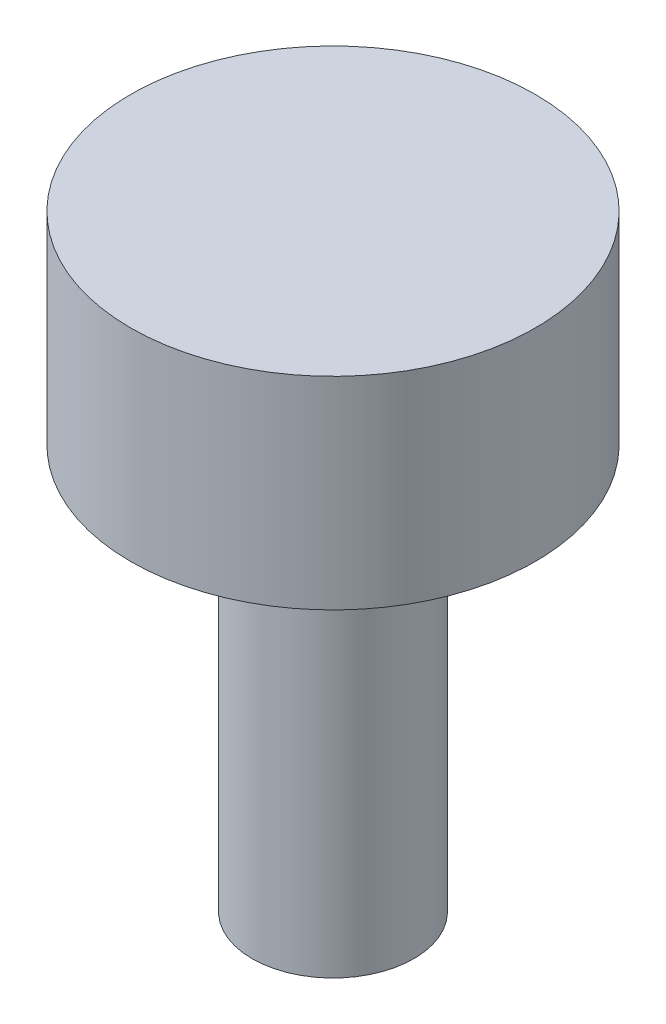
ISO-10303-21;
HEADER;
FILE_DESCRIPTION(('STEP AP214'),'2;1');
FILE_NAME('part.step','',(''),(''),'','','');
FILE_SCHEMA(('AUTOMOTIVE_DESIGN { 1 0 10303 214 1 1 1 1 }'));
ENDSEC;
DATA;
#1=APPLICATION_CONTEXT('core data for automotive mechanical design processes');
#2=APPLICATION_PROTOCOL_DEFINITION('international standard','automotive_design',2000,#1);
#3=PRODUCT_CONTEXT('',#1,'mechanical');
#4=PRODUCT('Part','Part','',(#3));
#5=PRODUCT_RELATED_PRODUCT_CATEGORY('part','',(#4));
#6=PRODUCT_DEFINITION_FORMATION('','',#4);
#7=PRODUCT_DEFINITION_CONTEXT('part definition',#1,'design');
#8=PRODUCT_DEFINITION('design','',#6,#7);
#9=PRODUCT_DEFINITION_SHAPE('','',#8);
#10=(LENGTH_UNIT() NAMED_UNIT(*) SI_UNIT(.MILLI.,.METRE.));
#11=(NAMED_UNIT(*) PLANE_ANGLE_UNIT() SI_UNIT($,.RADIAN.));
#12=(NAMED_UNIT(*) SI_UNIT($,.STERADIAN.) SOLID_ANGLE_UNIT());
#13=UNCERTAINTY_MEASURE_WITH_UNIT(LENGTH_MEASURE(1.E-05),#10,'distance_accuracy_value','');
#14=(GEOMETRIC_REPRESENTATION_CONTEXT(3) GLOBAL_UNCERTAINTY_ASSIGNED_CONTEXT((#13)) GLOBAL_UNIT_ASSIGNED_CONTEXT((#10,
#11,#12)) REPRESENTATION_CONTEXT('',''));
#15=CARTESIAN_POINT('',(0.,0.,0.));
#16=DIRECTION('',(0.,0.,1.));
#17=DIRECTION('',(1.,0.,0.));
#18=AXIS2_PLACEMENT_3D('',#15,#16,#17);
#19=CARTESIAN_POINT('',(0.,5.,0.));
#20=DIRECTION('',(0.,-1.,0.));
#21=DIRECTION('',(0.,0.,-1.));
#22=AXIS2_PLACEMENT_3D('',#19,#20,#21);
#23=CYLINDRICAL_SURFACE('',#22,1.);
#24=CARTESIAN_POINT('',(0.,5.,0.));
#25=DIRECTION('',(0.,1.,0.));
#26=DIRECTION('',(0.,0.,1.));
#27=AXIS2_PLACEMENT_3D('',#24,#25,#26);
#28=CIRCLE('',#27,1.);
#29=CARTESIAN_POINT('',(0.,5.,1.));
#30=VERTEX_POINT('',#29);
#31=EDGE_CURVE('E10',#30,#30,#28,.T.);
#32=ORIENTED_EDGE('',*,*,#31,.F.);
#33=EDGE_LOOP('',(#32));
#34=FACE_BOUND('',#33,.T.);
#35=CARTESIAN_POINT('',(0.,0.,0.));
#36=DIRECTION('',(0.,1.,0.));
#37=DIRECTION('',(0.,0.,1.));
#38=AXIS2_PLACEMENT_3D('',#35,#36,#37);
#39=CIRCLE('',#38,1.);
#40=CARTESIAN_POINT('',(0.,0.,1.));
#41=VERTEX_POINT('',#40);
#42=EDGE_CURVE('E34',#41,#41,#39,.T.);
#43=ORIENTED_EDGE('',*,*,#42,.T.);
#44=EDGE_LOOP('',(#43));
#45=FACE_BOUND('',#44,.T.);
#46=ADVANCED_FACE('F31',(#34,#45),#23,.T.);
#47=CARTESIAN_POINT('',(0.,0.,0.));
#48=DIRECTION('',(0.,1.,0.));
#49=DIRECTION('',(0.,0.,1.));
#50=AXIS2_PLACEMENT_3D('',#47,#48,#49);
#51=PLANE('',#50);
#52=ORIENTED_EDGE('',*,*,#42,.F.);
#53=EDGE_LOOP('',(#52));
#54=FACE_BOUND('',#53,.T.);
#55=ADVANCED_FACE('F54',(#54),#51,.F.);
#56=CARTESIAN_POINT('',(0.,7.5,0.));
#57=DIRECTION('',(0.,-1.,0.));
#58=DIRECTION('',(0.,0.,-1.));
#59=AXIS2_PLACEMENT_3D('',#56,#57,#58);
#60=CYLINDRICAL_SURFACE('',#59,2.5);
#61=CARTESIAN_POINT('',(0.,7.5,0.));
#62=DIRECTION('',(0.,1.,0.));
#63=DIRECTION('',(0.,0.,1.));
#64=AXIS2_PLACEMENT_3D('',#61,#62,#63);
#65=CIRCLE('',#64,2.5);
#66=CARTESIAN_POINT('',(0.,7.5,2.5));
#67=VERTEX_POINT('',#66);
#68=EDGE_CURVE('E41',#67,#67,#65,.T.);
#69=ORIENTED_EDGE('',*,*,#68,.F.);
#70=EDGE_LOOP('',(#69));
#71=FACE_BOUND('',#70,.T.);
#72=CARTESIAN_POINT('',(0.,5.,0.));
#73=DIRECTION('',(0.,1.,0.));
#74=DIRECTION('',(0.,0.,1.));
#75=AXIS2_PLACEMENT_3D('',#72,#73,#74);
#76=CIRCLE('',#75,2.5);
#77=CARTESIAN_POINT('',(0.,5.,2.5));
#78=VERTEX_POINT('',#77);
#79=EDGE_CURVE('E43',#78,#78,#76,.T.);
#80=ORIENTED_EDGE('',*,*,#79,.T.);
#81=EDGE_LOOP('',(#80));
#82=FACE_BOUND('',#81,.T.);
#83=ADVANCED_FACE('F51',(#71,#82),#60,.T.);
#84=CARTESIAN_POINT('',(0.,7.5,0.));
#85=DIRECTION('',(0.,1.,0.));
#86=DIRECTION('',(0.,0.,1.));
#87=AXIS2_PLACEMENT_3D('',#84,#85,#86);
#88=PLANE('',#87);
#89=ORIENTED_EDGE('',*,*,#68,.T.);
#90=EDGE_LOOP('',(#89));
#91=FACE_BOUND('',#90,.T.);
#92=ADVANCED_FACE('F49',(#91),#88,.T.);
#93=CARTESIAN_POINT('',(0.,5.,0.));
#94=DIRECTION('',(0.,1.,0.));
#95=DIRECTION('',(0.,0.,1.));
#96=AXIS2_PLACEMENT_3D('',#93,#94,#95);
#97=PLANE('',#96);
#98=ORIENTED_EDGE('',*,*,#31,.T.);
#99=EDGE_LOOP('',(#98));
#100=FACE_BOUND('',#99,.T.);
#101=ORIENTED_EDGE('',*,*,#79,.F.);
#102=EDGE_LOOP('',(#101));
#103=FACE_BOUND('',#102,.T.);
#104=ADVANCED_FACE('F58',(#100,#103),#97,.F.);
#105=CLOSED_SHELL('',(#46,#55,#83,#92,#104));
#106=MANIFOLD_SOLID_BREP('B2',#105);
#107=ADVANCED_BREP_SHAPE_REPRESENTATION('',(#18,#106),#14);
#108=SHAPE_DEFINITION_REPRESENTATION(#9,#107);
ENDSEC;
END-ISO-10303-21;
